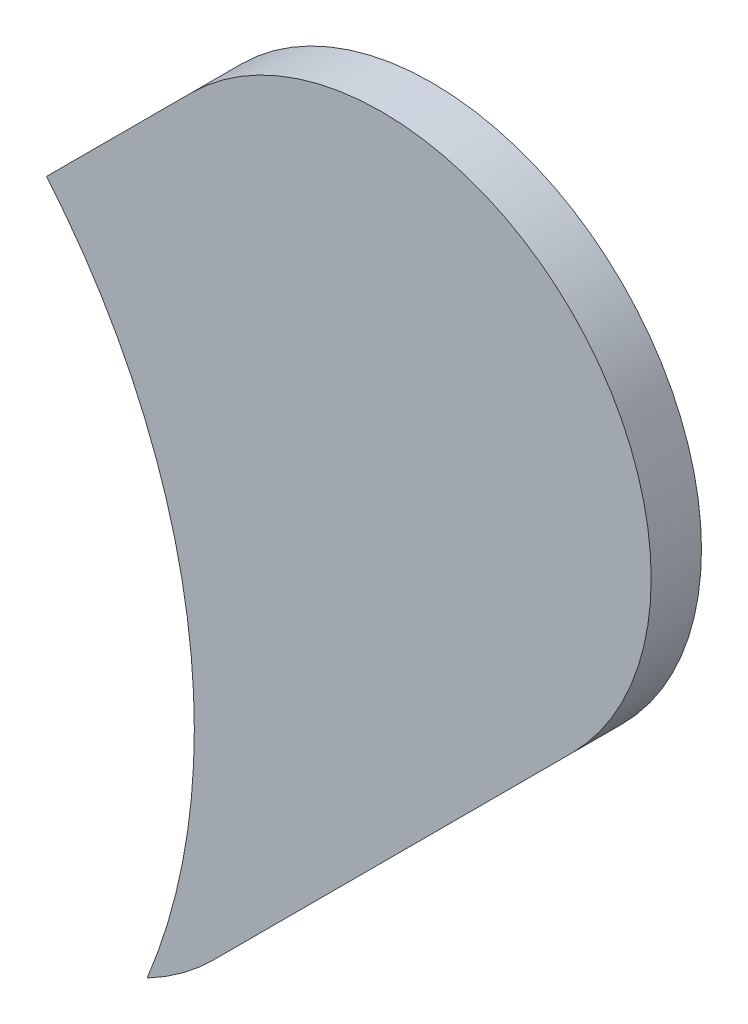
ISO-10303-21;
HEADER;
FILE_DESCRIPTION(('STEP AP214'),'2;1');
FILE_NAME('part.step','',(''),(''),'','','');
FILE_SCHEMA(('AUTOMOTIVE_DESIGN { 1 0 10303 214 1 1 1 1 }'));
ENDSEC;
DATA;
#1=APPLICATION_CONTEXT('core data for automotive mechanical design processes');
#2=APPLICATION_PROTOCOL_DEFINITION('international standard','automotive_design',2000,#1);
#3=PRODUCT_CONTEXT('',#1,'mechanical');
#4=PRODUCT('Part','Part','',(#3));
#5=PRODUCT_RELATED_PRODUCT_CATEGORY('part','',(#4));
#6=PRODUCT_DEFINITION_FORMATION('','',#4);
#7=PRODUCT_DEFINITION_CONTEXT('part definition',#1,'design');
#8=PRODUCT_DEFINITION('design','',#6,#7);
#9=PRODUCT_DEFINITION_SHAPE('','',#8);
#10=(LENGTH_UNIT() NAMED_UNIT(*) SI_UNIT(.MILLI.,.METRE.));
#11=(NAMED_UNIT(*) PLANE_ANGLE_UNIT() SI_UNIT($,.RADIAN.));
#12=(NAMED_UNIT(*) SI_UNIT($,.STERADIAN.) SOLID_ANGLE_UNIT());
#13=UNCERTAINTY_MEASURE_WITH_UNIT(LENGTH_MEASURE(1.E-05),#10,'distance_accuracy_value','');
#14=(GEOMETRIC_REPRESENTATION_CONTEXT(3) GLOBAL_UNCERTAINTY_ASSIGNED_CONTEXT((#13)) GLOBAL_UNIT_ASSIGNED_CONTEXT((#10,
#11,#12)) REPRESENTATION_CONTEXT('',''));
#15=CARTESIAN_POINT('',(0.,0.,0.));
#16=DIRECTION('',(0.,0.,1.));
#17=DIRECTION('',(1.,0.,0.));
#18=AXIS2_PLACEMENT_3D('',#15,#16,#17);
#19=CARTESIAN_POINT('',(5.91103974,11.049,0.));
#20=DIRECTION('',(0.,0.,-1.));
#21=DIRECTION('',(-0.707106781186545,0.70710678118655,0.));
#22=AXIS2_PLACEMENT_3D('',#19,#20,#21);
#23=CYLINDRICAL_SURFACE('',#22,0.190499969147464);
#24=CARTESIAN_POINT('',(5.91103974,11.049,0.03556));
#25=DIRECTION('',(0.,0.,1.));
#26=DIRECTION('',(-0.707106781186545,0.70710678118655,0.));
#27=AXIS2_PLACEMENT_3D('',#24,#25,#26);
#28=CIRCLE('',#27,0.190499969147464);
#29=CARTESIAN_POINT('',(5.9991640960553,10.8801085078667,0.03556));
#30=VERTEX_POINT('',#29);
#31=CARTESIAN_POINT('',(6.04574356,10.91429618,0.03556));
#32=VERTEX_POINT('',#31);
#33=EDGE_CURVE('E11',#30,#32,#28,.T.);
#34=ORIENTED_EDGE('',*,*,#33,.F.);
#35=DIRECTION('',(0.,0.,1.));
#36=VECTOR('',#35,1.);
#37=CARTESIAN_POINT('',(5.9991640960553,10.8801085078667,0.));
#38=LINE('',#37,#36);
#39=CARTESIAN_POINT('',(5.9991640960553,10.8801085078667,0.));
#40=VERTEX_POINT('',#39);
#41=EDGE_CURVE('E23',#40,#30,#38,.T.);
#42=ORIENTED_EDGE('',*,*,#41,.F.);
#43=CARTESIAN_POINT('',(5.91103974,11.049,0.));
#44=DIRECTION('',(0.,0.,1.));
#45=DIRECTION('',(-0.707106781186545,0.70710678118655,0.));
#46=AXIS2_PLACEMENT_3D('',#43,#44,#45);
#47=CIRCLE('',#46,0.190499969147464);
#48=CARTESIAN_POINT('',(6.04574356,10.91429618,0.));
#49=VERTEX_POINT('',#48);
#50=EDGE_CURVE('E114',#40,#49,#47,.T.);
#51=ORIENTED_EDGE('',*,*,#50,.T.);
#52=DIRECTION('',(0.,0.,1.));
#53=VECTOR('',#52,1.);
#54=CARTESIAN_POINT('',(6.04574356,10.91429618,0.));
#55=LINE('',#54,#53);
#56=EDGE_CURVE('E36',#49,#32,#55,.T.);
#57=ORIENTED_EDGE('',*,*,#56,.T.);
#58=EDGE_LOOP('',(#34,#42,#51,#57));
#59=FACE_BOUND('',#58,.T.);
#60=ADVANCED_FACE('F16',(#59),#23,.T.);
#61=CARTESIAN_POINT('',(5.588,11.049,0.));
#62=DIRECTION('',(0.,0.,-1.));
#63=DIRECTION('',(1.,0.,0.));
#64=AXIS2_PLACEMENT_3D('',#61,#62,#63);
#65=CYLINDRICAL_SURFACE('',#64,0.4445);
#66=ORIENTED_EDGE('',*,*,#41,.T.);
#67=CARTESIAN_POINT('',(5.588,11.049,0.03556));
#68=DIRECTION('',(0.,0.,1.));
#69=DIRECTION('',(1.,0.,0.));
#70=AXIS2_PLACEMENT_3D('',#67,#68,#69);
#71=CIRCLE('',#70,0.4445);
#72=CARTESIAN_POINT('',(6.0325,11.049,0.03556));
#73=VERTEX_POINT('',#72);
#74=EDGE_CURVE('E111',#30,#73,#71,.T.);
#75=ORIENTED_EDGE('',*,*,#74,.T.);
#76=DIRECTION('',(0.,0.,1.));
#77=VECTOR('',#76,1.);
#78=CARTESIAN_POINT('',(6.0325,11.049,0.));
#79=LINE('',#78,#77);
#80=CARTESIAN_POINT('',(6.0325,11.049,0.));
#81=VERTEX_POINT('',#80);
#82=EDGE_CURVE('E109',#81,#73,#79,.T.);
#83=ORIENTED_EDGE('',*,*,#82,.F.);
#84=CARTESIAN_POINT('',(5.588,11.049,0.));
#85=DIRECTION('',(0.,0.,1.));
#86=DIRECTION('',(1.,0.,0.));
#87=AXIS2_PLACEMENT_3D('',#84,#85,#86);
#88=CIRCLE('',#87,0.4445);
#89=EDGE_CURVE('E106',#40,#81,#88,.T.);
#90=ORIENTED_EDGE('',*,*,#89,.F.);
#91=EDGE_LOOP('',(#66,#75,#83,#90));
#92=FACE_BOUND('',#91,.T.);
#93=ADVANCED_FACE('F116',(#92),#65,.F.);
#94=CARTESIAN_POINT('',(5.588,11.049,0.));
#95=DIRECTION('',(0.,0.,-1.));
#96=DIRECTION('',(1.,0.,0.));
#97=AXIS2_PLACEMENT_3D('',#94,#95,#96);
#98=CYLINDRICAL_SURFACE('',#97,0.4445);
#99=ORIENTED_EDGE('',*,*,#82,.T.);
#100=CARTESIAN_POINT('',(5.588,11.049,0.03556));
#101=DIRECTION('',(0.,0.,1.));
#102=DIRECTION('',(1.,0.,0.));
#103=AXIS2_PLACEMENT_3D('',#100,#101,#102);
#104=CIRCLE('',#103,0.4445);
#105=CARTESIAN_POINT('',(5.9279789859653,11.3353468859653,0.03556));
#106=VERTEX_POINT('',#105);
#107=EDGE_CURVE('E103',#73,#106,#104,.T.);
#108=ORIENTED_EDGE('',*,*,#107,.T.);
#109=DIRECTION('',(0.,0.,1.));
#110=VECTOR('',#109,1.);
#111=CARTESIAN_POINT('',(5.9279789859653,11.3353468859653,0.));
#112=LINE('',#111,#110);
#113=CARTESIAN_POINT('',(5.9279789859653,11.3353468859653,0.));
#114=VERTEX_POINT('',#113);
#115=EDGE_CURVE('E101',#114,#106,#112,.T.);
#116=ORIENTED_EDGE('',*,*,#115,.F.);
#117=EDGE_CURVE('E100',#81,#114,#88,.T.);
#118=ORIENTED_EDGE('',*,*,#117,.F.);
#119=EDGE_LOOP('',(#99,#108,#116,#118));
#120=FACE_BOUND('',#119,.T.);
#121=ADVANCED_FACE('F120',(#120),#98,.F.);
#122=CARTESIAN_POINT('',(6.03033592,11.43770382,0.));
#123=DIRECTION('',(0.707106781186548,-0.707106781186548,0.));
#124=DIRECTION('',(-0.707106781186548,-0.707106781186548,0.));
#125=AXIS2_PLACEMENT_3D('',#122,#123,#124);
#126=PLANE('',#125);
#127=DIRECTION('',(-0.707106781186548,-0.707106781186548,0.));
#128=VECTOR('',#127,1.);
#129=CARTESIAN_POINT('',(6.03033592,11.43770382,0.03556));
#130=LINE('',#129,#128);
#131=CARTESIAN_POINT('',(6.03033592,11.43770382,0.03556));
#132=VERTEX_POINT('',#131);
#133=EDGE_CURVE('E97',#132,#106,#130,.T.);
#134=ORIENTED_EDGE('',*,*,#133,.F.);
#135=DIRECTION('',(0.,0.,1.));
#136=VECTOR('',#135,1.);
#137=CARTESIAN_POINT('',(6.03033592,11.43770382,0.));
#138=LINE('',#137,#136);
#139=CARTESIAN_POINT('',(6.03033592,11.43770382,0.));
#140=VERTEX_POINT('',#139);
#141=EDGE_CURVE('E95',#140,#132,#138,.T.);
#142=ORIENTED_EDGE('',*,*,#141,.F.);
#143=DIRECTION('',(-0.707106781186548,-0.707106781186548,0.));
#144=VECTOR('',#143,1.);
#145=CARTESIAN_POINT('',(6.03033592,11.43770382,0.));
#146=LINE('',#145,#144);
#147=EDGE_CURVE('E86',#140,#114,#146,.T.);
#148=ORIENTED_EDGE('',*,*,#147,.T.);
#149=ORIENTED_EDGE('',*,*,#115,.T.);
#150=EDGE_LOOP('',(#134,#142,#148,#149));
#151=FACE_BOUND('',#150,.T.);
#152=ADVANCED_FACE('F123',(#151),#126,.F.);
#153=CARTESIAN_POINT('',(6.16503974,11.303,0.));
#154=DIRECTION('',(0.,0.,-1.));
#155=DIRECTION('',(0.707106781186548,-0.707106781186548,0.));
#156=AXIS2_PLACEMENT_3D('',#153,#154,#155);
#157=CYLINDRICAL_SURFACE('',#156,0.190499969147464);
#158=CARTESIAN_POINT('',(6.16503974,11.303,0.03556));
#159=DIRECTION('',(0.,0.,1.));
#160=DIRECTION('',(0.707106781186548,-0.707106781186548,0.));
#161=AXIS2_PLACEMENT_3D('',#158,#159,#160);
#162=CIRCLE('',#161,0.190499969147464);
#163=CARTESIAN_POINT('',(6.29974356,11.16829618,0.03556));
#164=VERTEX_POINT('',#163);
#165=EDGE_CURVE('E72',#164,#132,#162,.T.);
#166=ORIENTED_EDGE('',*,*,#165,.F.);
#167=DIRECTION('',(0.,0.,1.));
#168=VECTOR('',#167,1.);
#169=CARTESIAN_POINT('',(6.29974356,11.16829618,0.));
#170=LINE('',#169,#168);
#171=CARTESIAN_POINT('',(6.29974356,11.16829618,0.));
#172=VERTEX_POINT('',#171);
#173=EDGE_CURVE('E67',#172,#164,#170,.T.);
#174=ORIENTED_EDGE('',*,*,#173,.F.);
#175=CARTESIAN_POINT('',(6.16503974,11.303,0.));
#176=DIRECTION('',(0.,0.,1.));
#177=DIRECTION('',(0.707106781186548,-0.707106781186548,0.));
#178=AXIS2_PLACEMENT_3D('',#175,#176,#177);
#179=CIRCLE('',#178,0.190499969147464);
#180=EDGE_CURVE('E70',#172,#140,#179,.T.);
#181=ORIENTED_EDGE('',*,*,#180,.T.);
#182=ORIENTED_EDGE('',*,*,#141,.T.);
#183=EDGE_LOOP('',(#166,#174,#181,#182));
#184=FACE_BOUND('',#183,.T.);
#185=ADVANCED_FACE('F69',(#184),#157,.T.);
#186=CARTESIAN_POINT('',(6.04574356,10.91429618,0.));
#187=DIRECTION('',(-0.707106781186548,0.707106781186548,0.));
#188=DIRECTION('',(0.707106781186548,0.707106781186548,0.));
#189=AXIS2_PLACEMENT_3D('',#186,#187,#188);
#190=PLANE('',#189);
#191=DIRECTION('',(0.707106781186548,0.707106781186548,0.));
#192=VECTOR('',#191,1.);
#193=CARTESIAN_POINT('',(6.04574356,10.91429618,0.03556));
#194=LINE('',#193,#192);
#195=EDGE_CURVE('E87',#32,#164,#194,.T.);
#196=ORIENTED_EDGE('',*,*,#195,.F.);
#197=ORIENTED_EDGE('',*,*,#56,.F.);
#198=DIRECTION('',(0.707106781186548,0.707106781186548,0.));
#199=VECTOR('',#198,1.);
#200=CARTESIAN_POINT('',(6.04574356,10.91429618,0.));
#201=LINE('',#200,#199);
#202=EDGE_CURVE('E83',#49,#172,#201,.T.);
#203=ORIENTED_EDGE('',*,*,#202,.T.);
#204=ORIENTED_EDGE('',*,*,#173,.T.);
#205=EDGE_LOOP('',(#196,#197,#203,#204));
#206=FACE_BOUND('',#205,.T.);
#207=ADVANCED_FACE('F89',(#206),#190,.F.);
#208=CARTESIAN_POINT('',(6.03803974,11.176,0.));
#209=DIRECTION('',(0.,0.,1.));
#210=DIRECTION('',(1.,0.,0.));
#211=AXIS2_PLACEMENT_3D('',#208,#209,#210);
#212=PLANE('',#211);
#213=ORIENTED_EDGE('',*,*,#202,.F.);
#214=ORIENTED_EDGE('',*,*,#50,.F.);
#215=ORIENTED_EDGE('',*,*,#89,.T.);
#216=ORIENTED_EDGE('',*,*,#117,.T.);
#217=ORIENTED_EDGE('',*,*,#147,.F.);
#218=ORIENTED_EDGE('',*,*,#180,.F.);
#219=EDGE_LOOP('',(#213,#214,#215,#216,#217,#218));
#220=FACE_BOUND('',#219,.T.);
#221=ADVANCED_FACE('F81',(#220),#212,.F.);
#222=CARTESIAN_POINT('',(6.03803974,11.176,0.03556));
#223=DIRECTION('',(0.,0.,1.));
#224=DIRECTION('',(1.,0.,0.));
#225=AXIS2_PLACEMENT_3D('',#222,#223,#224);
#226=PLANE('',#225);
#227=ORIENTED_EDGE('',*,*,#33,.T.);
#228=ORIENTED_EDGE('',*,*,#195,.T.);
#229=ORIENTED_EDGE('',*,*,#165,.T.);
#230=ORIENTED_EDGE('',*,*,#133,.T.);
#231=ORIENTED_EDGE('',*,*,#107,.F.);
#232=ORIENTED_EDGE('',*,*,#74,.F.);
#233=EDGE_LOOP('',(#227,#228,#229,#230,#231,#232));
#234=FACE_BOUND('',#233,.T.);
#235=ADVANCED_FACE('F125',(#234),#226,.T.);
#236=CLOSED_SHELL('',(#60,#93,#121,#152,#185,#207,#221,#235));
#237=MANIFOLD_SOLID_BREP('B1',#236);
#238=ADVANCED_BREP_SHAPE_REPRESENTATION('',(#18,#237),#14);
#239=SHAPE_DEFINITION_REPRESENTATION(#9,#238);
ENDSEC;
END-ISO-10303-21;
